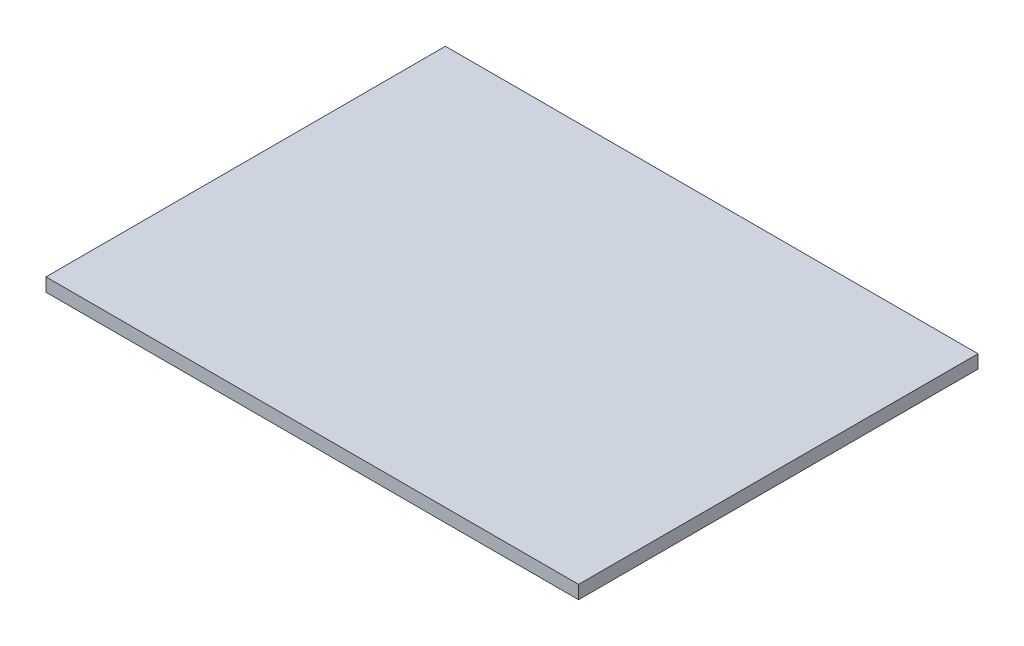
ISO-10303-21;
HEADER;
FILE_DESCRIPTION(('STEP AP214'),'2;1');
FILE_NAME('part.step','',(''),(''),'','','');
FILE_SCHEMA(('AUTOMOTIVE_DESIGN { 1 0 10303 214 1 1 1 1 }'));
ENDSEC;
DATA;
#1=APPLICATION_CONTEXT('core data for automotive mechanical design processes');
#2=APPLICATION_PROTOCOL_DEFINITION('international standard','automotive_design',2000,#1);
#3=PRODUCT_CONTEXT('',#1,'mechanical');
#4=PRODUCT('Part','Part','',(#3));
#5=PRODUCT_RELATED_PRODUCT_CATEGORY('part','',(#4));
#6=PRODUCT_DEFINITION_FORMATION('','',#4);
#7=PRODUCT_DEFINITION_CONTEXT('part definition',#1,'design');
#8=PRODUCT_DEFINITION('design','',#6,#7);
#9=PRODUCT_DEFINITION_SHAPE('','',#8);
#10=(LENGTH_UNIT() NAMED_UNIT(*) SI_UNIT(.MILLI.,.METRE.));
#11=(NAMED_UNIT(*) PLANE_ANGLE_UNIT() SI_UNIT($,.RADIAN.));
#12=(NAMED_UNIT(*) SI_UNIT($,.STERADIAN.) SOLID_ANGLE_UNIT());
#13=UNCERTAINTY_MEASURE_WITH_UNIT(LENGTH_MEASURE(1.E-05),#10,'distance_accuracy_value','');
#14=(GEOMETRIC_REPRESENTATION_CONTEXT(3) GLOBAL_UNCERTAINTY_ASSIGNED_CONTEXT((#13)) GLOBAL_UNIT_ASSIGNED_CONTEXT((#10,
#11,#12)) REPRESENTATION_CONTEXT('',''));
#15=CARTESIAN_POINT('',(0.,0.,0.));
#16=DIRECTION('',(0.,0.,1.));
#17=DIRECTION('',(1.,0.,0.));
#18=AXIS2_PLACEMENT_3D('',#15,#16,#17);
#19=CARTESIAN_POINT('',(-254.,12.7,-190.5));
#20=DIRECTION('',(1.,0.,0.));
#21=DIRECTION('',(0.,0.,-1.));
#22=AXIS2_PLACEMENT_3D('',#19,#20,#21);
#23=PLANE('',#22);
#24=DIRECTION('',(0.,0.,1.));
#25=VECTOR('',#24,1.);
#26=CARTESIAN_POINT('',(-254.,0.,-190.5));
#27=LINE('',#26,#25);
#28=CARTESIAN_POINT('',(-254.,0.,-190.5));
#29=VERTEX_POINT('',#28);
#30=CARTESIAN_POINT('',(-254.,0.,190.5));
#31=VERTEX_POINT('',#30);
#32=EDGE_CURVE('E95',#29,#31,#27,.T.);
#33=ORIENTED_EDGE('',*,*,#32,.T.);
#34=DIRECTION('',(0.,-1.,0.));
#35=VECTOR('',#34,1.);
#36=CARTESIAN_POINT('',(-254.,12.7,190.5));
#37=LINE('',#36,#35);
#38=CARTESIAN_POINT('',(-254.,12.7,190.5));
#39=VERTEX_POINT('',#38);
#40=EDGE_CURVE('E11',#39,#31,#37,.T.);
#41=ORIENTED_EDGE('',*,*,#40,.F.);
#42=DIRECTION('',(0.,0.,1.));
#43=VECTOR('',#42,1.);
#44=CARTESIAN_POINT('',(-254.,12.7,-190.5));
#45=LINE('',#44,#43);
#46=CARTESIAN_POINT('',(-254.,12.7,-190.5));
#47=VERTEX_POINT('',#46);
#48=EDGE_CURVE('E83',#47,#39,#45,.T.);
#49=ORIENTED_EDGE('',*,*,#48,.F.);
#50=DIRECTION('',(0.,-1.,0.));
#51=VECTOR('',#50,1.);
#52=CARTESIAN_POINT('',(-254.,12.7,-190.5));
#53=LINE('',#52,#51);
#54=EDGE_CURVE('E91',#47,#29,#53,.T.);
#55=ORIENTED_EDGE('',*,*,#54,.T.);
#56=EDGE_LOOP('',(#33,#41,#49,#55));
#57=FACE_BOUND('',#56,.T.);
#58=ADVANCED_FACE('F32',(#57),#23,.F.);
#59=CARTESIAN_POINT('',(-254.,12.7,190.5));
#60=DIRECTION('',(0.,0.,-1.));
#61=DIRECTION('',(-1.,0.,0.));
#62=AXIS2_PLACEMENT_3D('',#59,#60,#61);
#63=PLANE('',#62);
#64=DIRECTION('',(1.,0.,0.));
#65=VECTOR('',#64,1.);
#66=CARTESIAN_POINT('',(-254.,0.,190.5));
#67=LINE('',#66,#65);
#68=CARTESIAN_POINT('',(254.,0.,190.5));
#69=VERTEX_POINT('',#68);
#70=EDGE_CURVE('E87',#31,#69,#67,.T.);
#71=ORIENTED_EDGE('',*,*,#70,.T.);
#72=DIRECTION('',(0.,-1.,0.));
#73=VECTOR('',#72,1.);
#74=CARTESIAN_POINT('',(254.,12.7,190.5));
#75=LINE('',#74,#73);
#76=CARTESIAN_POINT('',(254.,12.7,190.5));
#77=VERTEX_POINT('',#76);
#78=EDGE_CURVE('E40',#77,#69,#75,.T.);
#79=ORIENTED_EDGE('',*,*,#78,.F.);
#80=DIRECTION('',(1.,0.,0.));
#81=VECTOR('',#80,1.);
#82=CARTESIAN_POINT('',(-254.,12.7,190.5));
#83=LINE('',#82,#81);
#84=EDGE_CURVE('E78',#39,#77,#83,.T.);
#85=ORIENTED_EDGE('',*,*,#84,.F.);
#86=ORIENTED_EDGE('',*,*,#40,.T.);
#87=EDGE_LOOP('',(#71,#79,#85,#86));
#88=FACE_BOUND('',#87,.T.);
#89=ADVANCED_FACE('F86',(#88),#63,.F.);
#90=CARTESIAN_POINT('',(254.,12.7,-190.5));
#91=DIRECTION('',(-1.,0.,0.));
#92=DIRECTION('',(0.,0.,1.));
#93=AXIS2_PLACEMENT_3D('',#90,#91,#92);
#94=PLANE('',#93);
#95=DIRECTION('',(0.,0.,-1.));
#96=VECTOR('',#95,1.);
#97=CARTESIAN_POINT('',(254.,0.,-190.5));
#98=LINE('',#97,#96);
#99=CARTESIAN_POINT('',(254.,0.,-190.5));
#100=VERTEX_POINT('',#99);
#101=EDGE_CURVE('E65',#69,#100,#98,.T.);
#102=ORIENTED_EDGE('',*,*,#101,.T.);
#103=DIRECTION('',(0.,-1.,0.));
#104=VECTOR('',#103,1.);
#105=CARTESIAN_POINT('',(254.,12.7,-190.5));
#106=LINE('',#105,#104);
#107=CARTESIAN_POINT('',(254.,12.7,-190.5));
#108=VERTEX_POINT('',#107);
#109=EDGE_CURVE('E88',#108,#100,#106,.T.);
#110=ORIENTED_EDGE('',*,*,#109,.F.);
#111=DIRECTION('',(0.,0.,-1.));
#112=VECTOR('',#111,1.);
#113=CARTESIAN_POINT('',(254.,12.7,-190.5));
#114=LINE('',#113,#112);
#115=EDGE_CURVE('E81',#77,#108,#114,.T.);
#116=ORIENTED_EDGE('',*,*,#115,.F.);
#117=ORIENTED_EDGE('',*,*,#78,.T.);
#118=EDGE_LOOP('',(#102,#110,#116,#117));
#119=FACE_BOUND('',#118,.T.);
#120=ADVANCED_FACE('F89',(#119),#94,.F.);
#121=CARTESIAN_POINT('',(-254.,12.7,-190.5));
#122=DIRECTION('',(0.,0.,1.));
#123=DIRECTION('',(1.,0.,0.));
#124=AXIS2_PLACEMENT_3D('',#121,#122,#123);
#125=PLANE('',#124);
#126=DIRECTION('',(-1.,0.,0.));
#127=VECTOR('',#126,1.);
#128=CARTESIAN_POINT('',(-254.,0.,-190.5));
#129=LINE('',#128,#127);
#130=EDGE_CURVE('E71',#100,#29,#129,.T.);
#131=ORIENTED_EDGE('',*,*,#130,.T.);
#132=ORIENTED_EDGE('',*,*,#54,.F.);
#133=DIRECTION('',(-1.,0.,0.));
#134=VECTOR('',#133,1.);
#135=CARTESIAN_POINT('',(-254.,12.7,-190.5));
#136=LINE('',#135,#134);
#137=EDGE_CURVE('E48',#108,#47,#136,.T.);
#138=ORIENTED_EDGE('',*,*,#137,.F.);
#139=ORIENTED_EDGE('',*,*,#109,.T.);
#140=EDGE_LOOP('',(#131,#132,#138,#139));
#141=FACE_BOUND('',#140,.T.);
#142=ADVANCED_FACE('F102',(#141),#125,.F.);
#143=CARTESIAN_POINT('',(0.,12.7,0.));
#144=DIRECTION('',(0.,1.,0.));
#145=DIRECTION('',(0.,0.,1.));
#146=AXIS2_PLACEMENT_3D('',#143,#144,#145);
#147=PLANE('',#146);
#148=ORIENTED_EDGE('',*,*,#48,.T.);
#149=ORIENTED_EDGE('',*,*,#84,.T.);
#150=ORIENTED_EDGE('',*,*,#115,.T.);
#151=ORIENTED_EDGE('',*,*,#137,.T.);
#152=EDGE_LOOP('',(#148,#149,#150,#151));
#153=FACE_BOUND('',#152,.T.);
#154=ADVANCED_FACE('F79',(#153),#147,.T.);
#155=CARTESIAN_POINT('',(0.,0.,0.));
#156=DIRECTION('',(0.,1.,0.));
#157=DIRECTION('',(0.,0.,1.));
#158=AXIS2_PLACEMENT_3D('',#155,#156,#157);
#159=PLANE('',#158);
#160=ORIENTED_EDGE('',*,*,#32,.F.);
#161=ORIENTED_EDGE('',*,*,#130,.F.);
#162=ORIENTED_EDGE('',*,*,#101,.F.);
#163=ORIENTED_EDGE('',*,*,#70,.F.);
#164=EDGE_LOOP('',(#160,#161,#162,#163));
#165=FACE_BOUND('',#164,.T.);
#166=ADVANCED_FACE('F105',(#165),#159,.F.);
#167=CLOSED_SHELL('',(#58,#89,#120,#142,#154,#166));
#168=MANIFOLD_SOLID_BREP('B2',#167);
#169=ADVANCED_BREP_SHAPE_REPRESENTATION('',(#18,#168),#14);
#170=SHAPE_DEFINITION_REPRESENTATION(#9,#169);
ENDSEC;
END-ISO-10303-21;
